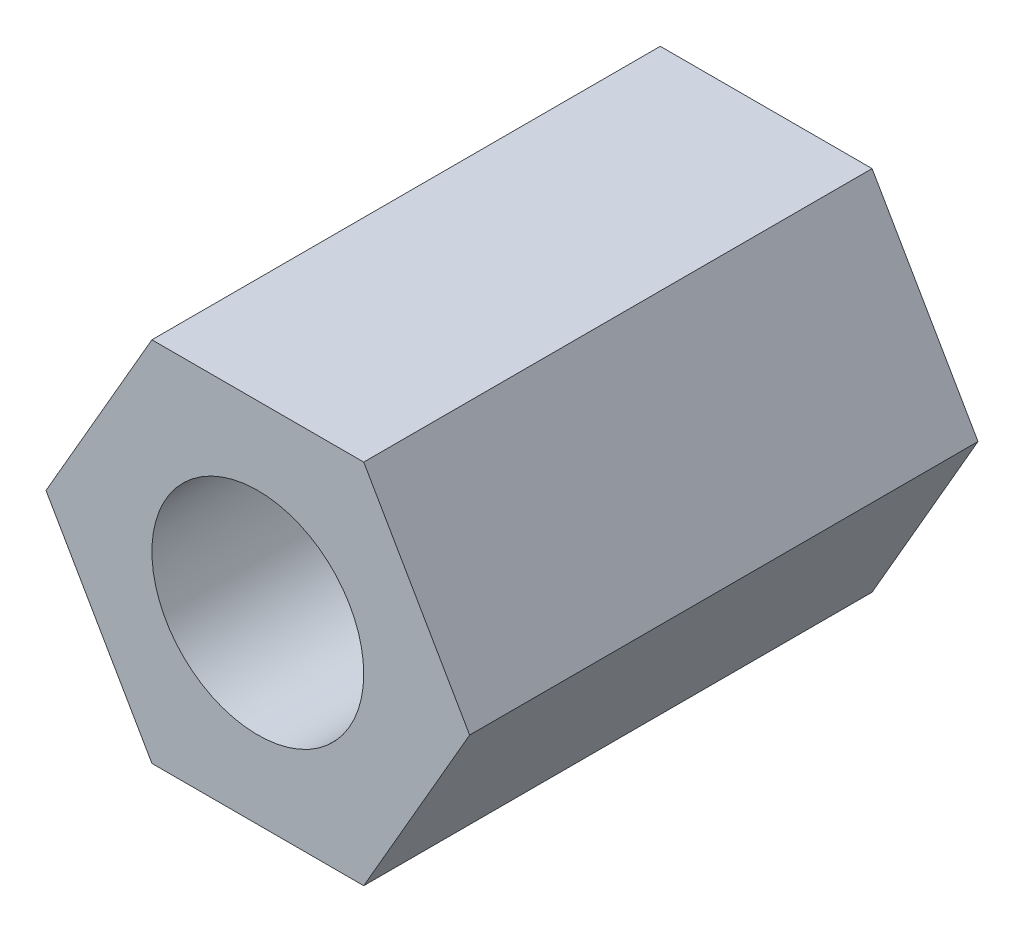
ISO-10303-21;
HEADER;
FILE_DESCRIPTION(('STEP AP214'),'2;1');
FILE_NAME('part.step','',(''),(''),'','','');
FILE_SCHEMA(('AUTOMOTIVE_DESIGN { 1 0 10303 214 1 1 1 1 }'));
ENDSEC;
DATA;
#1=APPLICATION_CONTEXT('core data for automotive mechanical design processes');
#2=APPLICATION_PROTOCOL_DEFINITION('international standard','automotive_design',2000,#1);
#3=PRODUCT_CONTEXT('',#1,'mechanical');
#4=PRODUCT('Part','Part','',(#3));
#5=PRODUCT_RELATED_PRODUCT_CATEGORY('part','',(#4));
#6=PRODUCT_DEFINITION_FORMATION('','',#4);
#7=PRODUCT_DEFINITION_CONTEXT('part definition',#1,'design');
#8=PRODUCT_DEFINITION('design','',#6,#7);
#9=PRODUCT_DEFINITION_SHAPE('','',#8);
#10=(LENGTH_UNIT() NAMED_UNIT(*) SI_UNIT(.MILLI.,.METRE.));
#11=(NAMED_UNIT(*) PLANE_ANGLE_UNIT() SI_UNIT($,.RADIAN.));
#12=(NAMED_UNIT(*) SI_UNIT($,.STERADIAN.) SOLID_ANGLE_UNIT());
#13=UNCERTAINTY_MEASURE_WITH_UNIT(LENGTH_MEASURE(1.E-05),#10,'distance_accuracy_value','');
#14=(GEOMETRIC_REPRESENTATION_CONTEXT(3) GLOBAL_UNCERTAINTY_ASSIGNED_CONTEXT((#13)) GLOBAL_UNIT_ASSIGNED_CONTEXT((#10,
#11,#12)) REPRESENTATION_CONTEXT('',''));
#15=CARTESIAN_POINT('',(0.,0.,0.));
#16=DIRECTION('',(0.,0.,1.));
#17=DIRECTION('',(1.,0.,0.));
#18=AXIS2_PLACEMENT_3D('',#15,#16,#17);
#19=CARTESIAN_POINT('',(-1.25,-2.1650635094611,6.));
#20=DIRECTION('',(0.866025403784438,-0.5,0.));
#21=DIRECTION('',(0.5,0.866025403784439,0.));
#22=AXIS2_PLACEMENT_3D('',#19,#20,#21);
#23=PLANE('',#22);
#24=DIRECTION('',(-0.5,-0.866025403784439,0.));
#25=VECTOR('',#24,1.);
#26=CARTESIAN_POINT('',(-1.25,-2.1650635094611,0.));
#27=LINE('',#26,#25);
#28=CARTESIAN_POINT('',(0.,0.,0.));
#29=VERTEX_POINT('',#28);
#30=CARTESIAN_POINT('',(-1.25,-2.1650635094611,0.));
#31=VERTEX_POINT('',#30);
#32=EDGE_CURVE('E120',#29,#31,#27,.T.);
#33=ORIENTED_EDGE('',*,*,#32,.T.);
#34=DIRECTION('',(0.,0.,-1.));
#35=VECTOR('',#34,1.);
#36=CARTESIAN_POINT('',(-1.25,-2.1650635094611,6.));
#37=LINE('',#36,#35);
#38=CARTESIAN_POINT('',(-1.25,-2.1650635094611,6.));
#39=VERTEX_POINT('',#38);
#40=EDGE_CURVE('E11',#39,#31,#37,.T.);
#41=ORIENTED_EDGE('',*,*,#40,.F.);
#42=DIRECTION('',(-0.5,-0.866025403784439,0.));
#43=VECTOR('',#42,1.);
#44=CARTESIAN_POINT('',(-1.25,-2.1650635094611,6.));
#45=LINE('',#44,#43);
#46=CARTESIAN_POINT('',(0.,0.,6.));
#47=VERTEX_POINT('',#46);
#48=EDGE_CURVE('E131',#47,#39,#45,.T.);
#49=ORIENTED_EDGE('',*,*,#48,.F.);
#50=DIRECTION('',(0.,0.,-1.));
#51=VECTOR('',#50,1.);
#52=CARTESIAN_POINT('',(0.,0.,6.));
#53=LINE('',#52,#51);
#54=EDGE_CURVE('E116',#47,#29,#53,.T.);
#55=ORIENTED_EDGE('',*,*,#54,.T.);
#56=EDGE_LOOP('',(#33,#41,#49,#55));
#57=FACE_BOUND('',#56,.T.);
#58=ADVANCED_FACE('F36',(#57),#23,.F.);
#59=CARTESIAN_POINT('',(0.,-4.33012701892219,6.));
#60=DIRECTION('',(0.866025403784438,0.5,0.));
#61=DIRECTION('',(-0.5,0.866025403784439,0.));
#62=AXIS2_PLACEMENT_3D('',#59,#60,#61);
#63=PLANE('',#62);
#64=DIRECTION('',(0.5,-0.866025403784439,0.));
#65=VECTOR('',#64,1.);
#66=CARTESIAN_POINT('',(0.,-4.33012701892219,0.));
#67=LINE('',#66,#65);
#68=CARTESIAN_POINT('',(0.,-4.33012701892219,0.));
#69=VERTEX_POINT('',#68);
#70=EDGE_CURVE('E123',#31,#69,#67,.T.);
#71=ORIENTED_EDGE('',*,*,#70,.T.);
#72=DIRECTION('',(0.,0.,-1.));
#73=VECTOR('',#72,1.);
#74=CARTESIAN_POINT('',(0.,-4.33012701892219,6.));
#75=LINE('',#74,#73);
#76=CARTESIAN_POINT('',(0.,-4.33012701892219,6.));
#77=VERTEX_POINT('',#76);
#78=EDGE_CURVE('E44',#77,#69,#75,.T.);
#79=ORIENTED_EDGE('',*,*,#78,.F.);
#80=DIRECTION('',(0.5,-0.866025403784439,0.));
#81=VECTOR('',#80,1.);
#82=CARTESIAN_POINT('',(0.,-4.33012701892219,6.));
#83=LINE('',#82,#81);
#84=EDGE_CURVE('E89',#39,#77,#83,.T.);
#85=ORIENTED_EDGE('',*,*,#84,.F.);
#86=ORIENTED_EDGE('',*,*,#40,.T.);
#87=EDGE_LOOP('',(#71,#79,#85,#86));
#88=FACE_BOUND('',#87,.T.);
#89=ADVANCED_FACE('F156',(#88),#63,.F.);
#90=CARTESIAN_POINT('',(2.5,-4.33012701892219,6.));
#91=DIRECTION('',(0.,1.,0.));
#92=DIRECTION('',(0.,0.,1.));
#93=AXIS2_PLACEMENT_3D('',#90,#91,#92);
#94=PLANE('',#93);
#95=DIRECTION('',(1.,0.,0.));
#96=VECTOR('',#95,1.);
#97=CARTESIAN_POINT('',(2.5,-4.33012701892219,0.));
#98=LINE('',#97,#96);
#99=CARTESIAN_POINT('',(2.5,-4.33012701892219,0.));
#100=VERTEX_POINT('',#99);
#101=EDGE_CURVE('E126',#69,#100,#98,.T.);
#102=ORIENTED_EDGE('',*,*,#101,.T.);
#103=DIRECTION('',(0.,0.,-1.));
#104=VECTOR('',#103,1.);
#105=CARTESIAN_POINT('',(2.5,-4.33012701892219,6.));
#106=LINE('',#105,#104);
#107=CARTESIAN_POINT('',(2.5,-4.33012701892219,6.));
#108=VERTEX_POINT('',#107);
#109=EDGE_CURVE('E111',#108,#100,#106,.T.);
#110=ORIENTED_EDGE('',*,*,#109,.F.);
#111=DIRECTION('',(1.,0.,0.));
#112=VECTOR('',#111,1.);
#113=CARTESIAN_POINT('',(2.5,-4.33012701892219,6.));
#114=LINE('',#113,#112);
#115=EDGE_CURVE('E102',#77,#108,#114,.T.);
#116=ORIENTED_EDGE('',*,*,#115,.F.);
#117=ORIENTED_EDGE('',*,*,#78,.T.);
#118=EDGE_LOOP('',(#102,#110,#116,#117));
#119=FACE_BOUND('',#118,.T.);
#120=ADVANCED_FACE('F137',(#119),#94,.F.);
#121=CARTESIAN_POINT('',(3.75,-2.1650635094611,6.));
#122=DIRECTION('',(-0.866025403784439,0.5,0.));
#123=DIRECTION('',(-0.5,-0.866025403784439,0.));
#124=AXIS2_PLACEMENT_3D('',#121,#122,#123);
#125=PLANE('',#124);
#126=DIRECTION('',(0.5,0.866025403784439,0.));
#127=VECTOR('',#126,1.);
#128=CARTESIAN_POINT('',(3.75,-2.1650635094611,0.));
#129=LINE('',#128,#127);
#130=CARTESIAN_POINT('',(3.75,-2.1650635094611,0.));
#131=VERTEX_POINT('',#130);
#132=EDGE_CURVE('E110',#100,#131,#129,.T.);
#133=ORIENTED_EDGE('',*,*,#132,.T.);
#134=DIRECTION('',(0.,0.,-1.));
#135=VECTOR('',#134,1.);
#136=CARTESIAN_POINT('',(3.75,-2.1650635094611,6.));
#137=LINE('',#136,#135);
#138=CARTESIAN_POINT('',(3.75,-2.1650635094611,6.));
#139=VERTEX_POINT('',#138);
#140=EDGE_CURVE('E107',#139,#131,#137,.T.);
#141=ORIENTED_EDGE('',*,*,#140,.F.);
#142=DIRECTION('',(0.5,0.866025403784439,0.));
#143=VECTOR('',#142,1.);
#144=CARTESIAN_POINT('',(3.75,-2.1650635094611,6.));
#145=LINE('',#144,#143);
#146=EDGE_CURVE('E96',#108,#139,#145,.T.);
#147=ORIENTED_EDGE('',*,*,#146,.F.);
#148=ORIENTED_EDGE('',*,*,#109,.T.);
#149=EDGE_LOOP('',(#133,#141,#147,#148));
#150=FACE_BOUND('',#149,.T.);
#151=ADVANCED_FACE('F108',(#150),#125,.F.);
#152=CARTESIAN_POINT('',(2.5,0.,6.));
#153=DIRECTION('',(-0.866025403784439,-0.5,0.));
#154=DIRECTION('',(0.5,-0.866025403784439,0.));
#155=AXIS2_PLACEMENT_3D('',#152,#153,#154);
#156=PLANE('',#155);
#157=DIRECTION('',(-0.5,0.866025403784439,0.));
#158=VECTOR('',#157,1.);
#159=CARTESIAN_POINT('',(2.5,0.,0.));
#160=LINE('',#159,#158);
#161=CARTESIAN_POINT('',(2.5,0.,0.));
#162=VERTEX_POINT('',#161);
#163=EDGE_CURVE('E75',#131,#162,#160,.T.);
#164=ORIENTED_EDGE('',*,*,#163,.T.);
#165=DIRECTION('',(0.,0.,-1.));
#166=VECTOR('',#165,1.);
#167=CARTESIAN_POINT('',(2.5,0.,6.));
#168=LINE('',#167,#166);
#169=CARTESIAN_POINT('',(2.5,0.,6.));
#170=VERTEX_POINT('',#169);
#171=EDGE_CURVE('E112',#170,#162,#168,.T.);
#172=ORIENTED_EDGE('',*,*,#171,.F.);
#173=DIRECTION('',(-0.5,0.866025403784439,0.));
#174=VECTOR('',#173,1.);
#175=CARTESIAN_POINT('',(2.5,0.,6.));
#176=LINE('',#175,#174);
#177=EDGE_CURVE('E100',#139,#170,#176,.T.);
#178=ORIENTED_EDGE('',*,*,#177,.F.);
#179=ORIENTED_EDGE('',*,*,#140,.T.);
#180=EDGE_LOOP('',(#164,#172,#178,#179));
#181=FACE_BOUND('',#180,.T.);
#182=ADVANCED_FACE('F114',(#181),#156,.F.);
#183=CARTESIAN_POINT('',(0.,0.,6.));
#184=DIRECTION('',(0.,-1.,0.));
#185=DIRECTION('',(0.,0.,-1.));
#186=AXIS2_PLACEMENT_3D('',#183,#184,#185);
#187=PLANE('',#186);
#188=DIRECTION('',(-1.,0.,0.));
#189=VECTOR('',#188,1.);
#190=CARTESIAN_POINT('',(0.,0.,0.));
#191=LINE('',#190,#189);
#192=EDGE_CURVE('E81',#162,#29,#191,.T.);
#193=ORIENTED_EDGE('',*,*,#192,.T.);
#194=ORIENTED_EDGE('',*,*,#54,.F.);
#195=DIRECTION('',(-1.,0.,0.));
#196=VECTOR('',#195,1.);
#197=CARTESIAN_POINT('',(0.,0.,6.));
#198=LINE('',#197,#196);
#199=EDGE_CURVE('E52',#170,#47,#198,.T.);
#200=ORIENTED_EDGE('',*,*,#199,.F.);
#201=ORIENTED_EDGE('',*,*,#171,.T.);
#202=EDGE_LOOP('',(#193,#194,#200,#201));
#203=FACE_BOUND('',#202,.T.);
#204=ADVANCED_FACE('F144',(#203),#187,.F.);
#205=CARTESIAN_POINT('',(0.,0.,6.));
#206=DIRECTION('',(0.,0.,-1.));
#207=DIRECTION('',(-1.,0.,0.));
#208=AXIS2_PLACEMENT_3D('',#205,#206,#207);
#209=PLANE('',#208);
#210=CARTESIAN_POINT('',(1.25,-2.1650635094611,6.));
#211=DIRECTION('',(0.,0.,1.));
#212=DIRECTION('',(1.,0.,0.));
#213=AXIS2_PLACEMENT_3D('',#210,#211,#212);
#214=CIRCLE('',#213,1.24999999999999);
#215=CARTESIAN_POINT('',(2.49999999999999,-2.1650635094611,6.));
#216=VERTEX_POINT('',#215);
#217=EDGE_CURVE('E213',#216,#216,#214,.T.);
#218=ORIENTED_EDGE('',*,*,#217,.F.);
#219=EDGE_LOOP('',(#218));
#220=FACE_BOUND('',#219,.T.);
#221=ORIENTED_EDGE('',*,*,#48,.T.);
#222=ORIENTED_EDGE('',*,*,#84,.T.);
#223=ORIENTED_EDGE('',*,*,#115,.T.);
#224=ORIENTED_EDGE('',*,*,#146,.T.);
#225=ORIENTED_EDGE('',*,*,#177,.T.);
#226=ORIENTED_EDGE('',*,*,#199,.T.);
#227=EDGE_LOOP('',(#221,#222,#223,#224,#225,#226));
#228=FACE_BOUND('',#227,.T.);
#229=ADVANCED_FACE('F98',(#220,#228),#209,.F.);
#230=CARTESIAN_POINT('',(0.,0.,0.));
#231=DIRECTION('',(0.,0.,-1.));
#232=DIRECTION('',(-1.,0.,0.));
#233=AXIS2_PLACEMENT_3D('',#230,#231,#232);
#234=PLANE('',#233);
#235=CARTESIAN_POINT('',(1.25,-2.1650635094611,0.));
#236=DIRECTION('',(0.,0.,1.));
#237=DIRECTION('',(1.,0.,0.));
#238=AXIS2_PLACEMENT_3D('',#235,#236,#237);
#239=CIRCLE('',#238,1.25);
#240=CARTESIAN_POINT('',(2.5,-2.1650635094611,0.));
#241=VERTEX_POINT('',#240);
#242=EDGE_CURVE('E124',#241,#241,#239,.T.);
#243=ORIENTED_EDGE('',*,*,#242,.T.);
#244=EDGE_LOOP('',(#243));
#245=FACE_BOUND('',#244,.T.);
#246=ORIENTED_EDGE('',*,*,#32,.F.);
#247=ORIENTED_EDGE('',*,*,#192,.F.);
#248=ORIENTED_EDGE('',*,*,#163,.F.);
#249=ORIENTED_EDGE('',*,*,#132,.F.);
#250=ORIENTED_EDGE('',*,*,#101,.F.);
#251=ORIENTED_EDGE('',*,*,#70,.F.);
#252=EDGE_LOOP('',(#246,#247,#248,#249,#250,#251));
#253=FACE_BOUND('',#252,.T.);
#254=ADVANCED_FACE('F140',(#245,#253),#234,.T.);
#255=CARTESIAN_POINT('',(1.25,-2.1650635094611,6.));
#256=DIRECTION('',(0.,0.,1.));
#257=DIRECTION('',(1.,0.,0.));
#258=AXIS2_PLACEMENT_3D('',#255,#256,#257);
#259=CYLINDRICAL_SURFACE('',#258,1.24999999999999);
#260=ORIENTED_EDGE('',*,*,#242,.F.);
#261=EDGE_LOOP('',(#260));
#262=FACE_BOUND('',#261,.T.);
#263=ORIENTED_EDGE('',*,*,#217,.T.);
#264=EDGE_LOOP('',(#263));
#265=FACE_BOUND('',#264,.T.);
#266=ADVANCED_FACE('F193',(#262,#265),#259,.F.);
#267=CLOSED_SHELL('',(#58,#89,#120,#151,#182,#204,#229,#254,#266));
#268=MANIFOLD_SOLID_BREP('B2',#267);
#269=ADVANCED_BREP_SHAPE_REPRESENTATION('',(#18,#268),#14);
#270=SHAPE_DEFINITION_REPRESENTATION(#9,#269);
ENDSEC;
END-ISO-10303-21;
